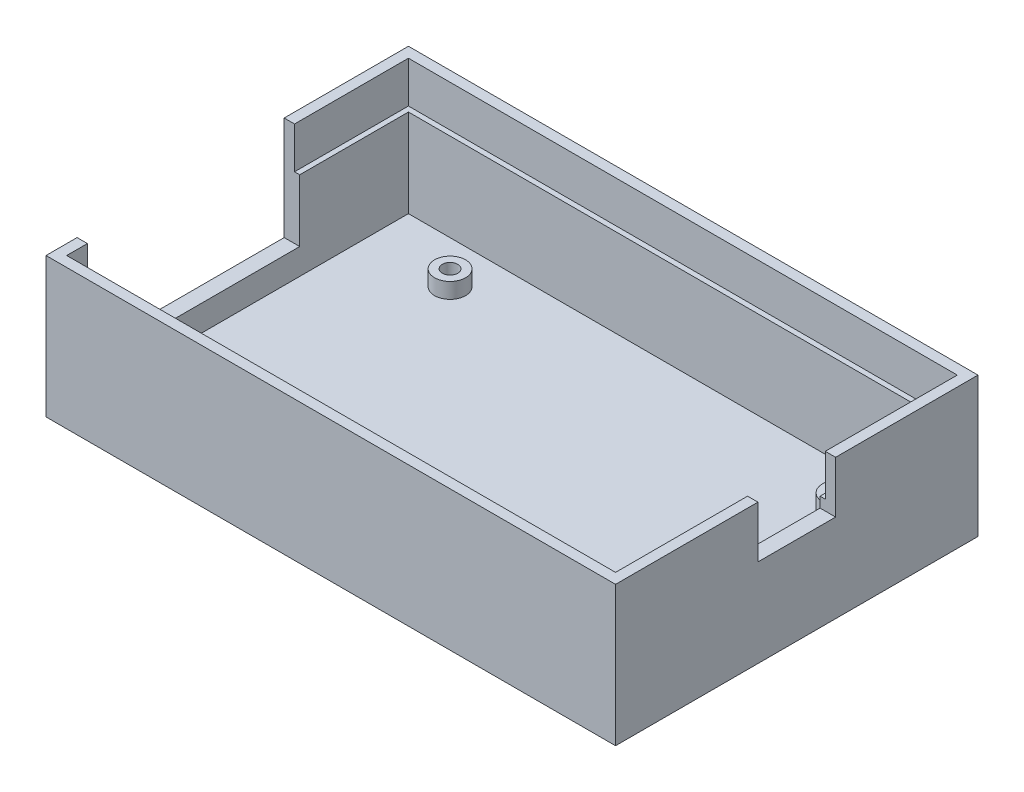
ISO-10303-21;
HEADER;
FILE_DESCRIPTION(('STEP AP214'),'2;1');
FILE_NAME('part.step','',(''),(''),'','','');
FILE_SCHEMA(('AUTOMOTIVE_DESIGN { 1 0 10303 214 1 1 1 1 }'));
ENDSEC;
DATA;
#1=APPLICATION_CONTEXT('core data for automotive mechanical design processes');
#2=APPLICATION_PROTOCOL_DEFINITION('international standard','automotive_design',2000,#1);
#3=PRODUCT_CONTEXT('',#1,'mechanical');
#4=PRODUCT('Part','Part','',(#3));
#5=PRODUCT_RELATED_PRODUCT_CATEGORY('part','',(#4));
#6=PRODUCT_DEFINITION_FORMATION('','',#4);
#7=PRODUCT_DEFINITION_CONTEXT('part definition',#1,'design');
#8=PRODUCT_DEFINITION('design','',#6,#7);
#9=PRODUCT_DEFINITION_SHAPE('','',#8);
#10=(LENGTH_UNIT() NAMED_UNIT(*) SI_UNIT(.MILLI.,.METRE.));
#11=(NAMED_UNIT(*) PLANE_ANGLE_UNIT() SI_UNIT($,.RADIAN.));
#12=(NAMED_UNIT(*) SI_UNIT($,.STERADIAN.) SOLID_ANGLE_UNIT());
#13=UNCERTAINTY_MEASURE_WITH_UNIT(LENGTH_MEASURE(1.E-05),#10,'distance_accuracy_value','');
#14=(GEOMETRIC_REPRESENTATION_CONTEXT(3) GLOBAL_UNCERTAINTY_ASSIGNED_CONTEXT((#13)) GLOBAL_UNIT_ASSIGNED_CONTEXT((#10,
#11,#12)) REPRESENTATION_CONTEXT('',''));
#15=CARTESIAN_POINT('',(0.,0.,0.));
#16=DIRECTION('',(0.,0.,1.));
#17=DIRECTION('',(1.,0.,0.));
#18=AXIS2_PLACEMENT_3D('',#15,#16,#17);
#19=CARTESIAN_POINT('',(0.,27.,0.));
#20=DIRECTION('',(0.,-1.,0.));
#21=DIRECTION('',(0.,0.,-1.));
#22=AXIS2_PLACEMENT_3D('',#19,#20,#21);
#23=PLANE('',#22);
#24=DIRECTION('',(0.,0.,-1.));
#25=VECTOR('',#24,1.);
#26=CARTESIAN_POINT('',(55.,27.,35.));
#27=LINE('',#26,#25);
#28=CARTESIAN_POINT('',(55.,27.,35.));
#29=VERTEX_POINT('',#28);
#30=CARTESIAN_POINT('',(55.,27.,7.5));
#31=VERTEX_POINT('',#30);
#32=EDGE_CURVE('E246',#29,#31,#27,.T.);
#33=ORIENTED_EDGE('',*,*,#32,.T.);
#34=DIRECTION('',(1.,0.,0.));
#35=VECTOR('',#34,1.);
#36=CARTESIAN_POINT('',(48.3230641142944,27.,7.5));
#37=LINE('',#36,#35);
#38=CARTESIAN_POINT('',(53.,27.,7.5));
#39=VERTEX_POINT('',#38);
#40=EDGE_CURVE('E447',#39,#31,#37,.T.);
#41=ORIENTED_EDGE('',*,*,#40,.F.);
#42=DIRECTION('',(0.,0.,-1.));
#43=VECTOR('',#42,1.);
#44=CARTESIAN_POINT('',(53.,27.,33.));
#45=LINE('',#44,#43);
#46=CARTESIAN_POINT('',(53.,27.,33.));
#47=VERTEX_POINT('',#46);
#48=EDGE_CURVE('E349',#47,#39,#45,.T.);
#49=ORIENTED_EDGE('',*,*,#48,.F.);
#50=DIRECTION('',(1.,0.,0.));
#51=VECTOR('',#50,1.);
#52=CARTESIAN_POINT('',(-53.,27.,33.));
#53=LINE('',#52,#51);
#54=CARTESIAN_POINT('',(-53.,27.,33.));
#55=VERTEX_POINT('',#54);
#56=EDGE_CURVE('E338',#55,#47,#53,.T.);
#57=ORIENTED_EDGE('',*,*,#56,.F.);
#58=DIRECTION('',(0.,0.,1.));
#59=VECTOR('',#58,1.);
#60=CARTESIAN_POINT('',(-53.,27.,33.));
#61=LINE('',#60,#59);
#62=CARTESIAN_POINT('',(-53.,27.,29.));
#63=VERTEX_POINT('',#62);
#64=EDGE_CURVE('E345',#63,#55,#61,.T.);
#65=ORIENTED_EDGE('',*,*,#64,.F.);
#66=DIRECTION('',(1.,0.,0.));
#67=VECTOR('',#66,1.);
#68=CARTESIAN_POINT('',(-58.,27.,29.));
#69=LINE('',#68,#67);
#70=CARTESIAN_POINT('',(-55.,27.,29.));
#71=VERTEX_POINT('',#70);
#72=EDGE_CURVE('E423',#71,#63,#69,.T.);
#73=ORIENTED_EDGE('',*,*,#72,.F.);
#74=DIRECTION('',(0.,0.,1.));
#75=VECTOR('',#74,1.);
#76=CARTESIAN_POINT('',(-55.,27.,35.));
#77=LINE('',#76,#75);
#78=CARTESIAN_POINT('',(-55.,27.,35.));
#79=VERTEX_POINT('',#78);
#80=EDGE_CURVE('E252',#71,#79,#77,.T.);
#81=ORIENTED_EDGE('',*,*,#80,.T.);
#82=DIRECTION('',(1.,0.,0.));
#83=VECTOR('',#82,1.);
#84=CARTESIAN_POINT('',(-55.,27.,35.));
#85=LINE('',#84,#83);
#86=EDGE_CURVE('E256',#79,#29,#85,.T.);
#87=ORIENTED_EDGE('',*,*,#86,.T.);
#88=EDGE_LOOP('',(#33,#41,#49,#57,#65,#73,#81,#87));
#89=FACE_BOUND('',#88,.T.);
#90=ADVANCED_FACE('F33',(#89),#23,.F.);
#91=CARTESIAN_POINT('',(53.,19.,33.));
#92=DIRECTION('',(1.,0.,0.));
#93=DIRECTION('',(0.,0.,-1.));
#94=AXIS2_PLACEMENT_3D('',#91,#92,#93);
#95=PLANE('',#94);
#96=ORIENTED_EDGE('',*,*,#48,.T.);
#97=DIRECTION('',(0.,-1.,0.));
#98=VECTOR('',#97,1.);
#99=CARTESIAN_POINT('',(53.,19.,7.5));
#100=LINE('',#99,#98);
#101=CARTESIAN_POINT('',(53.,19.,7.5));
#102=VERTEX_POINT('',#101);
#103=EDGE_CURVE('E435',#39,#102,#100,.T.);
#104=ORIENTED_EDGE('',*,*,#103,.T.);
#105=DIRECTION('',(0.,0.,-1.));
#106=VECTOR('',#105,1.);
#107=CARTESIAN_POINT('',(53.,19.,33.));
#108=LINE('',#107,#106);
#109=CARTESIAN_POINT('',(53.,19.,33.));
#110=VERTEX_POINT('',#109);
#111=EDGE_CURVE('E362',#110,#102,#108,.T.);
#112=ORIENTED_EDGE('',*,*,#111,.F.);
#113=DIRECTION('',(0.,1.,0.));
#114=VECTOR('',#113,1.);
#115=CARTESIAN_POINT('',(53.,19.,33.));
#116=LINE('',#115,#114);
#117=EDGE_CURVE('E326',#110,#47,#116,.T.);
#118=ORIENTED_EDGE('',*,*,#117,.T.);
#119=EDGE_LOOP('',(#96,#104,#112,#118));
#120=FACE_BOUND('',#119,.T.);
#121=ADVANCED_FACE('F496',(#120),#95,.F.);
#122=CARTESIAN_POINT('',(0.,19.,0.));
#123=DIRECTION('',(0.,-1.,0.));
#124=DIRECTION('',(0.,0.,-1.));
#125=AXIS2_PLACEMENT_3D('',#122,#123,#124);
#126=PLANE('',#125);
#127=ORIENTED_EDGE('',*,*,#111,.T.);
#128=DIRECTION('',(-1.,0.,0.));
#129=VECTOR('',#128,1.);
#130=CARTESIAN_POINT('',(0.,19.,7.5));
#131=LINE('',#130,#129);
#132=CARTESIAN_POINT('',(52.,19.,7.5));
#133=VERTEX_POINT('',#132);
#134=EDGE_CURVE('E438',#102,#133,#131,.T.);
#135=ORIENTED_EDGE('',*,*,#134,.T.);
#136=DIRECTION('',(0.,0.,1.));
#137=VECTOR('',#136,1.);
#138=CARTESIAN_POINT('',(52.,19.,32.));
#139=LINE('',#138,#137);
#140=CARTESIAN_POINT('',(52.,19.,32.));
#141=VERTEX_POINT('',#140);
#142=EDGE_CURVE('E213',#133,#141,#139,.T.);
#143=ORIENTED_EDGE('',*,*,#142,.T.);
#144=DIRECTION('',(-1.,0.,0.));
#145=VECTOR('',#144,1.);
#146=CARTESIAN_POINT('',(-52.,19.,32.));
#147=LINE('',#146,#145);
#148=CARTESIAN_POINT('',(-52.,19.,32.));
#149=VERTEX_POINT('',#148);
#150=EDGE_CURVE('E280',#141,#149,#147,.T.);
#151=ORIENTED_EDGE('',*,*,#150,.T.);
#152=DIRECTION('',(0.,0.,-1.));
#153=VECTOR('',#152,1.);
#154=CARTESIAN_POINT('',(-52.,19.,32.));
#155=LINE('',#154,#153);
#156=CARTESIAN_POINT('',(-52.,19.,29.));
#157=VERTEX_POINT('',#156);
#158=EDGE_CURVE('E223',#149,#157,#155,.T.);
#159=ORIENTED_EDGE('',*,*,#158,.T.);
#160=DIRECTION('',(-1.,0.,0.));
#161=VECTOR('',#160,1.);
#162=CARTESIAN_POINT('',(0.,19.,29.));
#163=LINE('',#162,#161);
#164=CARTESIAN_POINT('',(-53.,19.,29.));
#165=VERTEX_POINT('',#164);
#166=EDGE_CURVE('E406',#157,#165,#163,.T.);
#167=ORIENTED_EDGE('',*,*,#166,.T.);
#168=DIRECTION('',(0.,0.,1.));
#169=VECTOR('',#168,1.);
#170=CARTESIAN_POINT('',(-53.,19.,33.));
#171=LINE('',#170,#169);
#172=CARTESIAN_POINT('',(-53.,19.,33.));
#173=VERTEX_POINT('',#172);
#174=EDGE_CURVE('E358',#165,#173,#171,.T.);
#175=ORIENTED_EDGE('',*,*,#174,.T.);
#176=DIRECTION('',(1.,0.,0.));
#177=VECTOR('',#176,1.);
#178=CARTESIAN_POINT('',(-53.,19.,33.));
#179=LINE('',#178,#177);
#180=EDGE_CURVE('E332',#173,#110,#179,.T.);
#181=ORIENTED_EDGE('',*,*,#180,.T.);
#182=EDGE_LOOP('',(#127,#135,#143,#151,#159,#167,#175,#181));
#183=FACE_BOUND('',#182,.T.);
#184=ADVANCED_FACE('F323',(#183),#126,.F.);
#185=CARTESIAN_POINT('',(-53.,19.,33.));
#186=DIRECTION('',(-1.,0.,0.));
#187=DIRECTION('',(0.,0.,1.));
#188=AXIS2_PLACEMENT_3D('',#185,#186,#187);
#189=PLANE('',#188);
#190=ORIENTED_EDGE('',*,*,#174,.F.);
#191=DIRECTION('',(0.,1.,0.));
#192=VECTOR('',#191,1.);
#193=CARTESIAN_POINT('',(-53.,19.,29.));
#194=LINE('',#193,#192);
#195=EDGE_CURVE('E403',#165,#63,#194,.T.);
#196=ORIENTED_EDGE('',*,*,#195,.T.);
#197=ORIENTED_EDGE('',*,*,#64,.T.);
#198=DIRECTION('',(0.,1.,0.));
#199=VECTOR('',#198,1.);
#200=CARTESIAN_POINT('',(-53.,19.,33.));
#201=LINE('',#200,#199);
#202=EDGE_CURVE('E334',#173,#55,#201,.T.);
#203=ORIENTED_EDGE('',*,*,#202,.F.);
#204=EDGE_LOOP('',(#190,#196,#197,#203));
#205=FACE_BOUND('',#204,.T.);
#206=ADVANCED_FACE('F488',(#205),#189,.F.);
#207=CARTESIAN_POINT('',(55.,2.,35.));
#208=DIRECTION('',(-1.,0.,0.));
#209=DIRECTION('',(0.,0.,1.));
#210=AXIS2_PLACEMENT_3D('',#207,#208,#209);
#211=PLANE('',#210);
#212=DIRECTION('',(0.,0.,1.));
#213=VECTOR('',#212,1.);
#214=CARTESIAN_POINT('',(55.,17.,35.));
#215=LINE('',#214,#213);
#216=CARTESIAN_POINT('',(55.,17.,-7.5));
#217=VERTEX_POINT('',#216);
#218=CARTESIAN_POINT('',(55.,17.,7.5));
#219=VERTEX_POINT('',#218);
#220=EDGE_CURVE('E208',#217,#219,#215,.T.);
#221=ORIENTED_EDGE('',*,*,#220,.T.);
#222=DIRECTION('',(0.,1.,0.));
#223=VECTOR('',#222,1.);
#224=CARTESIAN_POINT('',(55.,2.,7.5));
#225=LINE('',#224,#223);
#226=EDGE_CURVE('E207',#219,#31,#225,.T.);
#227=ORIENTED_EDGE('',*,*,#226,.T.);
#228=ORIENTED_EDGE('',*,*,#32,.F.);
#229=DIRECTION('',(0.,-1.,0.));
#230=VECTOR('',#229,1.);
#231=CARTESIAN_POINT('',(55.,2.,35.));
#232=LINE('',#231,#230);
#233=CARTESIAN_POINT('',(55.,0.,35.));
#234=VERTEX_POINT('',#233);
#235=EDGE_CURVE('E268',#29,#234,#232,.T.);
#236=ORIENTED_EDGE('',*,*,#235,.T.);
#237=DIRECTION('',(0.,0.,-1.));
#238=VECTOR('',#237,1.);
#239=CARTESIAN_POINT('',(55.,0.,35.));
#240=LINE('',#239,#238);
#241=CARTESIAN_POINT('',(55.,0.,-35.));
#242=VERTEX_POINT('',#241);
#243=EDGE_CURVE('E259',#234,#242,#240,.T.);
#244=ORIENTED_EDGE('',*,*,#243,.T.);
#245=DIRECTION('',(0.,-1.,0.));
#246=VECTOR('',#245,1.);
#247=CARTESIAN_POINT('',(55.,2.,-35.));
#248=LINE('',#247,#246);
#249=CARTESIAN_POINT('',(55.,27.,-35.));
#250=VERTEX_POINT('',#249);
#251=EDGE_CURVE('E277',#250,#242,#248,.T.);
#252=ORIENTED_EDGE('',*,*,#251,.F.);
#253=CARTESIAN_POINT('',(55.,27.,-7.5));
#254=VERTEX_POINT('',#253);
#255=EDGE_CURVE('E245',#254,#250,#27,.T.);
#256=ORIENTED_EDGE('',*,*,#255,.F.);
#257=DIRECTION('',(0.,-1.,0.));
#258=VECTOR('',#257,1.);
#259=CARTESIAN_POINT('',(55.,2.,-7.5));
#260=LINE('',#259,#258);
#261=EDGE_CURVE('E440',#254,#217,#260,.T.);
#262=ORIENTED_EDGE('',*,*,#261,.T.);
#263=EDGE_LOOP('',(#221,#227,#228,#236,#244,#252,#256,#262));
#264=FACE_BOUND('',#263,.T.);
#265=ADVANCED_FACE('F35',(#264),#211,.F.);
#266=CARTESIAN_POINT('',(-55.,2.,-35.));
#267=DIRECTION('',(0.,0.,1.));
#268=DIRECTION('',(1.,0.,0.));
#269=AXIS2_PLACEMENT_3D('',#266,#267,#268);
#270=PLANE('',#269);
#271=DIRECTION('',(-1.,0.,0.));
#272=VECTOR('',#271,1.);
#273=CARTESIAN_POINT('',(-55.,0.,-35.));
#274=LINE('',#273,#272);
#275=CARTESIAN_POINT('',(-55.,0.,-35.));
#276=VERTEX_POINT('',#275);
#277=EDGE_CURVE('E262',#242,#276,#274,.T.);
#278=ORIENTED_EDGE('',*,*,#277,.T.);
#279=DIRECTION('',(0.,-1.,0.));
#280=VECTOR('',#279,1.);
#281=CARTESIAN_POINT('',(-55.,2.,-35.));
#282=LINE('',#281,#280);
#283=CARTESIAN_POINT('',(-55.,27.,-35.));
#284=VERTEX_POINT('',#283);
#285=EDGE_CURVE('E274',#284,#276,#282,.T.);
#286=ORIENTED_EDGE('',*,*,#285,.F.);
#287=DIRECTION('',(-1.,0.,0.));
#288=VECTOR('',#287,1.);
#289=CARTESIAN_POINT('',(-55.,27.,-35.));
#290=LINE('',#289,#288);
#291=EDGE_CURVE('E249',#250,#284,#290,.T.);
#292=ORIENTED_EDGE('',*,*,#291,.F.);
#293=ORIENTED_EDGE('',*,*,#251,.T.);
#294=EDGE_LOOP('',(#278,#286,#292,#293));
#295=FACE_BOUND('',#294,.T.);
#296=ADVANCED_FACE('F502',(#295),#270,.F.);
#297=CARTESIAN_POINT('',(-55.,2.,35.));
#298=DIRECTION('',(1.,0.,0.));
#299=DIRECTION('',(0.,0.,-1.));
#300=AXIS2_PLACEMENT_3D('',#297,#298,#299);
#301=PLANE('',#300);
#302=ORIENTED_EDGE('',*,*,#80,.F.);
#303=DIRECTION('',(0.,-1.,0.));
#304=VECTOR('',#303,1.);
#305=CARTESIAN_POINT('',(-55.,2.,29.));
#306=LINE('',#305,#304);
#307=CARTESIAN_POINT('',(-55.,7.,29.));
#308=VERTEX_POINT('',#307);
#309=EDGE_CURVE('E387',#71,#308,#306,.T.);
#310=ORIENTED_EDGE('',*,*,#309,.T.);
#311=DIRECTION('',(0.,0.,-1.));
#312=VECTOR('',#311,1.);
#313=CARTESIAN_POINT('',(-55.,7.,35.));
#314=LINE('',#313,#312);
#315=CARTESIAN_POINT('',(-55.,7.,-11.));
#316=VERTEX_POINT('',#315);
#317=EDGE_CURVE('E416',#308,#316,#314,.T.);
#318=ORIENTED_EDGE('',*,*,#317,.T.);
#319=DIRECTION('',(0.,1.,0.));
#320=VECTOR('',#319,1.);
#321=CARTESIAN_POINT('',(-55.,2.,-11.));
#322=LINE('',#321,#320);
#323=CARTESIAN_POINT('',(-55.,27.,-11.));
#324=VERTEX_POINT('',#323);
#325=EDGE_CURVE('E408',#316,#324,#322,.T.);
#326=ORIENTED_EDGE('',*,*,#325,.T.);
#327=EDGE_CURVE('E253',#284,#324,#77,.T.);
#328=ORIENTED_EDGE('',*,*,#327,.F.);
#329=ORIENTED_EDGE('',*,*,#285,.T.);
#330=DIRECTION('',(0.,0.,1.));
#331=VECTOR('',#330,1.);
#332=CARTESIAN_POINT('',(-55.,0.,35.));
#333=LINE('',#332,#331);
#334=CARTESIAN_POINT('',(-55.,0.,35.));
#335=VERTEX_POINT('',#334);
#336=EDGE_CURVE('E264',#276,#335,#333,.T.);
#337=ORIENTED_EDGE('',*,*,#336,.T.);
#338=DIRECTION('',(0.,-1.,0.));
#339=VECTOR('',#338,1.);
#340=CARTESIAN_POINT('',(-55.,2.,35.));
#341=LINE('',#340,#339);
#342=EDGE_CURVE('E271',#79,#335,#341,.T.);
#343=ORIENTED_EDGE('',*,*,#342,.F.);
#344=EDGE_LOOP('',(#302,#310,#318,#326,#328,#329,#337,#343));
#345=FACE_BOUND('',#344,.T.);
#346=ADVANCED_FACE('F474',(#345),#301,.F.);
#347=CARTESIAN_POINT('',(-55.,2.,35.));
#348=DIRECTION('',(0.,0.,-1.));
#349=DIRECTION('',(-1.,0.,0.));
#350=AXIS2_PLACEMENT_3D('',#347,#348,#349);
#351=PLANE('',#350);
#352=DIRECTION('',(1.,0.,0.));
#353=VECTOR('',#352,1.);
#354=CARTESIAN_POINT('',(-55.,0.,35.));
#355=LINE('',#354,#353);
#356=EDGE_CURVE('E266',#335,#234,#355,.T.);
#357=ORIENTED_EDGE('',*,*,#356,.T.);
#358=ORIENTED_EDGE('',*,*,#235,.F.);
#359=ORIENTED_EDGE('',*,*,#86,.F.);
#360=ORIENTED_EDGE('',*,*,#342,.T.);
#361=EDGE_LOOP('',(#357,#358,#359,#360));
#362=FACE_BOUND('',#361,.T.);
#363=ADVANCED_FACE('F507',(#362),#351,.F.);
#364=CARTESIAN_POINT('',(0.,0.,0.));
#365=DIRECTION('',(0.,-1.,0.));
#366=DIRECTION('',(0.,0.,-1.));
#367=AXIS2_PLACEMENT_3D('',#364,#365,#366);
#368=PLANE('',#367);
#369=ORIENTED_EDGE('',*,*,#243,.F.);
#370=ORIENTED_EDGE('',*,*,#356,.F.);
#371=ORIENTED_EDGE('',*,*,#336,.F.);
#372=ORIENTED_EDGE('',*,*,#277,.F.);
#373=EDGE_LOOP('',(#369,#370,#371,#372));
#374=FACE_BOUND('',#373,.T.);
#375=ADVANCED_FACE('F504',(#374),#368,.T.);
#376=CARTESIAN_POINT('',(53.,27.,-7.5));
#377=VERTEX_POINT('',#376);
#378=CARTESIAN_POINT('',(53.,27.,-33.));
#379=VERTEX_POINT('',#378);
#380=EDGE_CURVE('E352',#377,#379,#45,.T.);
#381=ORIENTED_EDGE('',*,*,#380,.F.);
#382=DIRECTION('',(-1.,0.,0.));
#383=VECTOR('',#382,1.);
#384=CARTESIAN_POINT('',(48.3230641142944,27.,-7.5));
#385=LINE('',#384,#383);
#386=EDGE_CURVE('E449',#254,#377,#385,.T.);
#387=ORIENTED_EDGE('',*,*,#386,.F.);
#388=ORIENTED_EDGE('',*,*,#255,.T.);
#389=ORIENTED_EDGE('',*,*,#291,.T.);
#390=ORIENTED_EDGE('',*,*,#327,.T.);
#391=DIRECTION('',(-1.,0.,0.));
#392=VECTOR('',#391,1.);
#393=CARTESIAN_POINT('',(-58.,27.,-11.));
#394=LINE('',#393,#392);
#395=CARTESIAN_POINT('',(-53.,27.,-11.));
#396=VERTEX_POINT('',#395);
#397=EDGE_CURVE('E426',#396,#324,#394,.T.);
#398=ORIENTED_EDGE('',*,*,#397,.F.);
#399=CARTESIAN_POINT('',(-53.,27.,-33.));
#400=VERTEX_POINT('',#399);
#401=EDGE_CURVE('E342',#400,#396,#61,.T.);
#402=ORIENTED_EDGE('',*,*,#401,.F.);
#403=DIRECTION('',(-1.,0.,0.));
#404=VECTOR('',#403,1.);
#405=CARTESIAN_POINT('',(-53.,27.,-33.));
#406=LINE('',#405,#404);
#407=EDGE_CURVE('E346',#379,#400,#406,.T.);
#408=ORIENTED_EDGE('',*,*,#407,.F.);
#409=EDGE_LOOP('',(#381,#387,#388,#389,#390,#398,#402,#408));
#410=FACE_BOUND('',#409,.T.);
#411=ADVANCED_FACE('F459',(#410),#23,.F.);
#412=CARTESIAN_POINT('',(53.,19.,-7.5));
#413=VERTEX_POINT('',#412);
#414=CARTESIAN_POINT('',(53.,19.,-33.));
#415=VERTEX_POINT('',#414);
#416=EDGE_CURVE('E341',#413,#415,#108,.T.);
#417=ORIENTED_EDGE('',*,*,#416,.F.);
#418=DIRECTION('',(0.,1.,0.));
#419=VECTOR('',#418,1.);
#420=CARTESIAN_POINT('',(53.,19.,-7.5));
#421=LINE('',#420,#419);
#422=EDGE_CURVE('E442',#413,#377,#421,.T.);
#423=ORIENTED_EDGE('',*,*,#422,.T.);
#424=ORIENTED_EDGE('',*,*,#380,.T.);
#425=DIRECTION('',(0.,1.,0.));
#426=VECTOR('',#425,1.);
#427=CARTESIAN_POINT('',(53.,19.,-33.));
#428=LINE('',#427,#426);
#429=EDGE_CURVE('E328',#415,#379,#428,.T.);
#430=ORIENTED_EDGE('',*,*,#429,.F.);
#431=EDGE_LOOP('',(#417,#423,#424,#430));
#432=FACE_BOUND('',#431,.T.);
#433=ADVANCED_FACE('F456',(#432),#95,.F.);
#434=CARTESIAN_POINT('',(-53.,19.,33.));
#435=DIRECTION('',(0.,0.,1.));
#436=DIRECTION('',(1.,0.,0.));
#437=AXIS2_PLACEMENT_3D('',#434,#435,#436);
#438=PLANE('',#437);
#439=ORIENTED_EDGE('',*,*,#56,.T.);
#440=ORIENTED_EDGE('',*,*,#117,.F.);
#441=ORIENTED_EDGE('',*,*,#180,.F.);
#442=ORIENTED_EDGE('',*,*,#202,.T.);
#443=EDGE_LOOP('',(#439,#440,#441,#442));
#444=FACE_BOUND('',#443,.T.);
#445=ADVANCED_FACE('F493',(#444),#438,.F.);
#446=ORIENTED_EDGE('',*,*,#401,.T.);
#447=DIRECTION('',(0.,-1.,0.));
#448=VECTOR('',#447,1.);
#449=CARTESIAN_POINT('',(-53.,19.,-11.));
#450=LINE('',#449,#448);
#451=CARTESIAN_POINT('',(-53.,19.,-11.));
#452=VERTEX_POINT('',#451);
#453=EDGE_CURVE('E411',#396,#452,#450,.T.);
#454=ORIENTED_EDGE('',*,*,#453,.T.);
#455=CARTESIAN_POINT('',(-53.,19.,-33.));
#456=VERTEX_POINT('',#455);
#457=EDGE_CURVE('E355',#456,#452,#171,.T.);
#458=ORIENTED_EDGE('',*,*,#457,.F.);
#459=DIRECTION('',(0.,1.,0.));
#460=VECTOR('',#459,1.);
#461=CARTESIAN_POINT('',(-53.,19.,-33.));
#462=LINE('',#461,#460);
#463=EDGE_CURVE('E331',#456,#400,#462,.T.);
#464=ORIENTED_EDGE('',*,*,#463,.T.);
#465=EDGE_LOOP('',(#446,#454,#458,#464));
#466=FACE_BOUND('',#465,.T.);
#467=ADVANCED_FACE('F467',(#466),#189,.F.);
#468=CARTESIAN_POINT('',(-53.,19.,-33.));
#469=DIRECTION('',(0.,0.,-1.));
#470=DIRECTION('',(-1.,0.,0.));
#471=AXIS2_PLACEMENT_3D('',#468,#469,#470);
#472=PLANE('',#471);
#473=ORIENTED_EDGE('',*,*,#407,.T.);
#474=ORIENTED_EDGE('',*,*,#463,.F.);
#475=DIRECTION('',(-1.,0.,0.));
#476=VECTOR('',#475,1.);
#477=CARTESIAN_POINT('',(-53.,19.,-33.));
#478=LINE('',#477,#476);
#479=EDGE_CURVE('E359',#415,#456,#478,.T.);
#480=ORIENTED_EDGE('',*,*,#479,.F.);
#481=ORIENTED_EDGE('',*,*,#429,.T.);
#482=EDGE_LOOP('',(#473,#474,#480,#481));
#483=FACE_BOUND('',#482,.T.);
#484=ADVANCED_FACE('F463',(#483),#472,.F.);
#485=CARTESIAN_POINT('',(52.,19.,-32.));
#486=VERTEX_POINT('',#485);
#487=CARTESIAN_POINT('',(52.,19.,-7.5));
#488=VERTEX_POINT('',#487);
#489=EDGE_CURVE('E218',#486,#488,#139,.T.);
#490=ORIENTED_EDGE('',*,*,#489,.T.);
#491=DIRECTION('',(1.,0.,0.));
#492=VECTOR('',#491,1.);
#493=CARTESIAN_POINT('',(0.,19.,-7.5));
#494=LINE('',#493,#492);
#495=EDGE_CURVE('E296',#488,#413,#494,.T.);
#496=ORIENTED_EDGE('',*,*,#495,.T.);
#497=ORIENTED_EDGE('',*,*,#416,.T.);
#498=ORIENTED_EDGE('',*,*,#479,.T.);
#499=ORIENTED_EDGE('',*,*,#457,.T.);
#500=DIRECTION('',(1.,0.,0.));
#501=VECTOR('',#500,1.);
#502=CARTESIAN_POINT('',(0.,19.,-11.));
#503=LINE('',#502,#501);
#504=CARTESIAN_POINT('',(-52.,19.,-11.));
#505=VERTEX_POINT('',#504);
#506=EDGE_CURVE('E414',#452,#505,#503,.T.);
#507=ORIENTED_EDGE('',*,*,#506,.T.);
#508=CARTESIAN_POINT('',(-52.,19.,-32.));
#509=VERTEX_POINT('',#508);
#510=EDGE_CURVE('E305',#505,#509,#155,.T.);
#511=ORIENTED_EDGE('',*,*,#510,.T.);
#512=DIRECTION('',(1.,0.,0.));
#513=VECTOR('',#512,1.);
#514=CARTESIAN_POINT('',(-52.,19.,-32.));
#515=LINE('',#514,#513);
#516=EDGE_CURVE('E219',#509,#486,#515,.T.);
#517=ORIENTED_EDGE('',*,*,#516,.T.);
#518=EDGE_LOOP('',(#490,#496,#497,#498,#499,#507,#511,#517));
#519=FACE_BOUND('',#518,.T.);
#520=ADVANCED_FACE('F300',(#519),#126,.F.);
#521=CARTESIAN_POINT('',(0.,2.,0.));
#522=DIRECTION('',(0.,-1.,0.));
#523=DIRECTION('',(0.,0.,-1.));
#524=AXIS2_PLACEMENT_3D('',#521,#522,#523);
#525=PLANE('',#524);
#526=CARTESIAN_POINT('',(45.52,2.,24.46));
#527=DIRECTION('',(0.,-1.,0.));
#528=DIRECTION('',(0.,0.,-1.));
#529=AXIS2_PLACEMENT_3D('',#526,#527,#528);
#530=CIRCLE('',#529,3.);
#531=CARTESIAN_POINT('',(45.52,2.,21.46));
#532=VERTEX_POINT('',#531);
#533=EDGE_CURVE('E201',#532,#532,#530,.F.);
#534=ORIENTED_EDGE('',*,*,#533,.F.);
#535=EDGE_LOOP('',(#534));
#536=FACE_BOUND('',#535,.T.);
#537=CARTESIAN_POINT('',(39.17,2.,-23.8));
#538=DIRECTION('',(0.,-1.,0.));
#539=DIRECTION('',(0.,0.,-1.));
#540=AXIS2_PLACEMENT_3D('',#537,#538,#539);
#541=CIRCLE('',#540,3.);
#542=CARTESIAN_POINT('',(39.17,2.,-26.8));
#543=VERTEX_POINT('',#542);
#544=EDGE_CURVE('E288',#543,#543,#541,.F.);
#545=ORIENTED_EDGE('',*,*,#544,.F.);
#546=EDGE_LOOP('',(#545));
#547=FACE_BOUND('',#546,.T.);
#548=CARTESIAN_POINT('',(-35.76,2.,-23.8));
#549=DIRECTION('',(0.,-1.,0.));
#550=DIRECTION('',(0.,0.,-1.));
#551=AXIS2_PLACEMENT_3D('',#548,#549,#550);
#552=CIRCLE('',#551,3.);
#553=CARTESIAN_POINT('',(-35.76,2.,-26.8));
#554=VERTEX_POINT('',#553);
#555=EDGE_CURVE('E285',#554,#554,#552,.F.);
#556=ORIENTED_EDGE('',*,*,#555,.F.);
#557=EDGE_LOOP('',(#556));
#558=FACE_BOUND('',#557,.T.);
#559=CARTESIAN_POINT('',(-37.03,2.,24.46));
#560=DIRECTION('',(0.,-1.,0.));
#561=DIRECTION('',(0.,0.,-1.));
#562=AXIS2_PLACEMENT_3D('',#559,#560,#561);
#563=CIRCLE('',#562,3.);
#564=CARTESIAN_POINT('',(-37.03,2.,21.46));
#565=VERTEX_POINT('',#564);
#566=EDGE_CURVE('E282',#565,#565,#563,.F.);
#567=ORIENTED_EDGE('',*,*,#566,.F.);
#568=EDGE_LOOP('',(#567));
#569=FACE_BOUND('',#568,.T.);
#570=DIRECTION('',(1.,0.,0.));
#571=VECTOR('',#570,1.);
#572=CARTESIAN_POINT('',(-52.,2.,32.));
#573=LINE('',#572,#571);
#574=CARTESIAN_POINT('',(-52.,2.,32.));
#575=VERTEX_POINT('',#574);
#576=CARTESIAN_POINT('',(52.,2.,32.));
#577=VERTEX_POINT('',#576);
#578=EDGE_CURVE('E235',#575,#577,#573,.T.);
#579=ORIENTED_EDGE('',*,*,#578,.T.);
#580=DIRECTION('',(0.,0.,-1.));
#581=VECTOR('',#580,1.);
#582=CARTESIAN_POINT('',(52.,2.,32.));
#583=LINE('',#582,#581);
#584=CARTESIAN_POINT('',(52.,2.,-32.));
#585=VERTEX_POINT('',#584);
#586=EDGE_CURVE('E222',#577,#585,#583,.T.);
#587=ORIENTED_EDGE('',*,*,#586,.T.);
#588=DIRECTION('',(-1.,0.,0.));
#589=VECTOR('',#588,1.);
#590=CARTESIAN_POINT('',(-52.,2.,-32.));
#591=LINE('',#590,#589);
#592=CARTESIAN_POINT('',(-52.,2.,-32.));
#593=VERTEX_POINT('',#592);
#594=EDGE_CURVE('E229',#585,#593,#591,.T.);
#595=ORIENTED_EDGE('',*,*,#594,.T.);
#596=DIRECTION('',(0.,0.,1.));
#597=VECTOR('',#596,1.);
#598=CARTESIAN_POINT('',(-52.,2.,32.));
#599=LINE('',#598,#597);
#600=EDGE_CURVE('E232',#593,#575,#599,.T.);
#601=ORIENTED_EDGE('',*,*,#600,.T.);
#602=EDGE_LOOP('',(#579,#587,#595,#601));
#603=FACE_BOUND('',#602,.T.);
#604=ADVANCED_FACE('F318',(#536,#547,#558,#569,#603),#525,.F.);
#605=CARTESIAN_POINT('',(-52.,27.,32.));
#606=DIRECTION('',(0.,0.,-1.));
#607=DIRECTION('',(-1.,0.,0.));
#608=AXIS2_PLACEMENT_3D('',#605,#606,#607);
#609=PLANE('',#608);
#610=ORIENTED_EDGE('',*,*,#150,.F.);
#611=DIRECTION('',(0.,-1.,0.));
#612=VECTOR('',#611,1.);
#613=CARTESIAN_POINT('',(52.,27.,32.));
#614=LINE('',#613,#612);
#615=EDGE_CURVE('E215',#141,#577,#614,.T.);
#616=ORIENTED_EDGE('',*,*,#615,.T.);
#617=ORIENTED_EDGE('',*,*,#578,.F.);
#618=DIRECTION('',(0.,-1.,0.));
#619=VECTOR('',#618,1.);
#620=CARTESIAN_POINT('',(-52.,27.,32.));
#621=LINE('',#620,#619);
#622=EDGE_CURVE('E239',#149,#575,#621,.T.);
#623=ORIENTED_EDGE('',*,*,#622,.F.);
#624=EDGE_LOOP('',(#610,#616,#617,#623));
#625=FACE_BOUND('',#624,.T.);
#626=ADVANCED_FACE('F320',(#625),#609,.T.);
#627=CARTESIAN_POINT('',(-52.,27.,32.));
#628=DIRECTION('',(1.,0.,0.));
#629=DIRECTION('',(0.,0.,-1.));
#630=AXIS2_PLACEMENT_3D('',#627,#628,#629);
#631=PLANE('',#630);
#632=DIRECTION('',(0.,1.,0.));
#633=VECTOR('',#632,1.);
#634=CARTESIAN_POINT('',(-52.,7.,29.));
#635=LINE('',#634,#633);
#636=CARTESIAN_POINT('',(-52.,7.,29.));
#637=VERTEX_POINT('',#636);
#638=EDGE_CURVE('E56',#637,#157,#635,.T.);
#639=ORIENTED_EDGE('',*,*,#638,.T.);
#640=ORIENTED_EDGE('',*,*,#158,.F.);
#641=ORIENTED_EDGE('',*,*,#622,.T.);
#642=ORIENTED_EDGE('',*,*,#600,.F.);
#643=DIRECTION('',(0.,-1.,0.));
#644=VECTOR('',#643,1.);
#645=CARTESIAN_POINT('',(-52.,27.,-32.));
#646=LINE('',#645,#644);
#647=EDGE_CURVE('E241',#509,#593,#646,.T.);
#648=ORIENTED_EDGE('',*,*,#647,.F.);
#649=ORIENTED_EDGE('',*,*,#510,.F.);
#650=DIRECTION('',(0.,1.,0.));
#651=VECTOR('',#650,1.);
#652=CARTESIAN_POINT('',(-52.,7.,-11.));
#653=LINE('',#652,#651);
#654=CARTESIAN_POINT('',(-52.,7.,-11.));
#655=VERTEX_POINT('',#654);
#656=EDGE_CURVE('E419',#655,#505,#653,.T.);
#657=ORIENTED_EDGE('',*,*,#656,.F.);
#658=DIRECTION('',(0.,0.,-1.));
#659=VECTOR('',#658,1.);
#660=CARTESIAN_POINT('',(-52.,7.,29.));
#661=LINE('',#660,#659);
#662=EDGE_CURVE('E425',#637,#655,#661,.T.);
#663=ORIENTED_EDGE('',*,*,#662,.F.);
#664=EDGE_LOOP('',(#639,#640,#641,#642,#648,#649,#657,#663));
#665=FACE_BOUND('',#664,.T.);
#666=ADVANCED_FACE('F312',(#665),#631,.T.);
#667=CARTESIAN_POINT('',(-52.,27.,-32.));
#668=DIRECTION('',(0.,0.,1.));
#669=DIRECTION('',(1.,0.,0.));
#670=AXIS2_PLACEMENT_3D('',#667,#668,#669);
#671=PLANE('',#670);
#672=ORIENTED_EDGE('',*,*,#516,.F.);
#673=ORIENTED_EDGE('',*,*,#647,.T.);
#674=ORIENTED_EDGE('',*,*,#594,.F.);
#675=DIRECTION('',(0.,-1.,0.));
#676=VECTOR('',#675,1.);
#677=CARTESIAN_POINT('',(52.,27.,-32.));
#678=LINE('',#677,#676);
#679=EDGE_CURVE('E243',#486,#585,#678,.T.);
#680=ORIENTED_EDGE('',*,*,#679,.F.);
#681=EDGE_LOOP('',(#672,#673,#674,#680));
#682=FACE_BOUND('',#681,.T.);
#683=ADVANCED_FACE('F308',(#682),#671,.T.);
#684=CARTESIAN_POINT('',(52.,27.,32.));
#685=DIRECTION('',(-1.,0.,0.));
#686=DIRECTION('',(0.,0.,1.));
#687=AXIS2_PLACEMENT_3D('',#684,#685,#686);
#688=PLANE('',#687);
#689=DIRECTION('',(0.,1.,0.));
#690=VECTOR('',#689,1.);
#691=CARTESIAN_POINT('',(52.,27.,7.5));
#692=LINE('',#691,#690);
#693=CARTESIAN_POINT('',(52.,17.,7.5));
#694=VERTEX_POINT('',#693);
#695=EDGE_CURVE('E11',#694,#133,#692,.T.);
#696=ORIENTED_EDGE('',*,*,#695,.F.);
#697=DIRECTION('',(0.,0.,1.));
#698=VECTOR('',#697,1.);
#699=CARTESIAN_POINT('',(52.,17.,32.));
#700=LINE('',#699,#698);
#701=CARTESIAN_POINT('',(52.,17.,-7.5));
#702=VERTEX_POINT('',#701);
#703=EDGE_CURVE('E193',#702,#694,#700,.T.);
#704=ORIENTED_EDGE('',*,*,#703,.F.);
#705=DIRECTION('',(0.,-1.,0.));
#706=VECTOR('',#705,1.);
#707=CARTESIAN_POINT('',(52.,27.,-7.5));
#708=LINE('',#707,#706);
#709=EDGE_CURVE('E41',#488,#702,#708,.T.);
#710=ORIENTED_EDGE('',*,*,#709,.F.);
#711=ORIENTED_EDGE('',*,*,#489,.F.);
#712=ORIENTED_EDGE('',*,*,#679,.T.);
#713=ORIENTED_EDGE('',*,*,#586,.F.);
#714=ORIENTED_EDGE('',*,*,#615,.F.);
#715=ORIENTED_EDGE('',*,*,#142,.F.);
#716=EDGE_LOOP('',(#696,#704,#710,#711,#712,#713,#714,#715));
#717=FACE_BOUND('',#716,.T.);
#718=ADVANCED_FACE('F211',(#717),#688,.T.);
#719=CARTESIAN_POINT('',(-37.03,5.,24.46));
#720=DIRECTION('',(0.,-1.,0.));
#721=DIRECTION('',(0.,0.,-1.));
#722=AXIS2_PLACEMENT_3D('',#719,#720,#721);
#723=CYLINDRICAL_SURFACE('',#722,3.);
#724=CARTESIAN_POINT('',(-37.03,5.,24.46));
#725=DIRECTION('',(0.,1.,0.));
#726=DIRECTION('',(0.,0.,1.));
#727=AXIS2_PLACEMENT_3D('',#724,#725,#726);
#728=CIRCLE('',#727,3.);
#729=CARTESIAN_POINT('',(-37.03,5.,27.46));
#730=VERTEX_POINT('',#729);
#731=EDGE_CURVE('E364',#730,#730,#728,.T.);
#732=ORIENTED_EDGE('',*,*,#731,.F.);
#733=EDGE_LOOP('',(#732));
#734=FACE_BOUND('',#733,.T.);
#735=ORIENTED_EDGE('',*,*,#566,.T.);
#736=EDGE_LOOP('',(#735));
#737=FACE_BOUND('',#736,.T.);
#738=ADVANCED_FACE('F541',(#734,#737),#723,.T.);
#739=CARTESIAN_POINT('',(-37.03,5.,24.46));
#740=DIRECTION('',(0.,1.,0.));
#741=DIRECTION('',(0.,0.,1.));
#742=AXIS2_PLACEMENT_3D('',#739,#740,#741);
#743=PLANE('',#742);
#744=CARTESIAN_POINT('',(-37.03,5.,24.46));
#745=DIRECTION('',(0.,1.,0.));
#746=DIRECTION('',(0.,0.,1.));
#747=AXIS2_PLACEMENT_3D('',#744,#745,#746);
#748=CIRCLE('',#747,1.5);
#749=CARTESIAN_POINT('',(-37.03,5.,25.96));
#750=VERTEX_POINT('',#749);
#751=EDGE_CURVE('E396',#750,#750,#748,.T.);
#752=ORIENTED_EDGE('',*,*,#751,.F.);
#753=EDGE_LOOP('',(#752));
#754=FACE_BOUND('',#753,.T.);
#755=ORIENTED_EDGE('',*,*,#731,.T.);
#756=EDGE_LOOP('',(#755));
#757=FACE_BOUND('',#756,.T.);
#758=ADVANCED_FACE('F545',(#754,#757),#743,.T.);
#759=CARTESIAN_POINT('',(-35.76,5.,-23.8));
#760=DIRECTION('',(0.,-1.,0.));
#761=DIRECTION('',(0.,0.,-1.));
#762=AXIS2_PLACEMENT_3D('',#759,#760,#761);
#763=CYLINDRICAL_SURFACE('',#762,3.);
#764=CARTESIAN_POINT('',(-35.76,5.,-23.8));
#765=DIRECTION('',(0.,1.,0.));
#766=DIRECTION('',(0.,0.,1.));
#767=AXIS2_PLACEMENT_3D('',#764,#765,#766);
#768=CIRCLE('',#767,3.);
#769=CARTESIAN_POINT('',(-35.76,5.,-20.8));
#770=VERTEX_POINT('',#769);
#771=EDGE_CURVE('E367',#770,#770,#768,.T.);
#772=ORIENTED_EDGE('',*,*,#771,.F.);
#773=EDGE_LOOP('',(#772));
#774=FACE_BOUND('',#773,.T.);
#775=ORIENTED_EDGE('',*,*,#555,.T.);
#776=EDGE_LOOP('',(#775));
#777=FACE_BOUND('',#776,.T.);
#778=ADVANCED_FACE('F551',(#774,#777),#763,.T.);
#779=CARTESIAN_POINT('',(-35.76,5.,-23.8));
#780=DIRECTION('',(0.,1.,0.));
#781=DIRECTION('',(0.,0.,1.));
#782=AXIS2_PLACEMENT_3D('',#779,#780,#781);
#783=PLANE('',#782);
#784=CARTESIAN_POINT('',(-35.76,5.,-23.8));
#785=DIRECTION('',(0.,1.,0.));
#786=DIRECTION('',(0.,0.,1.));
#787=AXIS2_PLACEMENT_3D('',#784,#785,#786);
#788=CIRCLE('',#787,1.5);
#789=CARTESIAN_POINT('',(-35.76,5.,-22.3));
#790=VERTEX_POINT('',#789);
#791=EDGE_CURVE('E377',#790,#790,#788,.T.);
#792=ORIENTED_EDGE('',*,*,#791,.F.);
#793=EDGE_LOOP('',(#792));
#794=FACE_BOUND('',#793,.T.);
#795=ORIENTED_EDGE('',*,*,#771,.T.);
#796=EDGE_LOOP('',(#795));
#797=FACE_BOUND('',#796,.T.);
#798=ADVANCED_FACE('F744',(#794,#797),#783,.T.);
#799=CARTESIAN_POINT('',(39.17,5.,-23.8));
#800=DIRECTION('',(0.,-1.,0.));
#801=DIRECTION('',(0.,0.,-1.));
#802=AXIS2_PLACEMENT_3D('',#799,#800,#801);
#803=CYLINDRICAL_SURFACE('',#802,3.);
#804=CARTESIAN_POINT('',(39.17,5.,-23.8));
#805=DIRECTION('',(0.,1.,0.));
#806=DIRECTION('',(0.,0.,1.));
#807=AXIS2_PLACEMENT_3D('',#804,#805,#806);
#808=CIRCLE('',#807,3.);
#809=CARTESIAN_POINT('',(39.17,5.,-20.8));
#810=VERTEX_POINT('',#809);
#811=EDGE_CURVE('E370',#810,#810,#808,.T.);
#812=ORIENTED_EDGE('',*,*,#811,.F.);
#813=EDGE_LOOP('',(#812));
#814=FACE_BOUND('',#813,.T.);
#815=ORIENTED_EDGE('',*,*,#544,.T.);
#816=EDGE_LOOP('',(#815));
#817=FACE_BOUND('',#816,.T.);
#818=ADVANCED_FACE('F736',(#814,#817),#803,.T.);
#819=CARTESIAN_POINT('',(39.17,5.,-23.8));
#820=DIRECTION('',(0.,1.,0.));
#821=DIRECTION('',(0.,0.,1.));
#822=AXIS2_PLACEMENT_3D('',#819,#820,#821);
#823=PLANE('',#822);
#824=CARTESIAN_POINT('',(39.17,5.,-23.8));
#825=DIRECTION('',(0.,1.,0.));
#826=DIRECTION('',(0.,0.,1.));
#827=AXIS2_PLACEMENT_3D('',#824,#825,#826);
#828=CIRCLE('',#827,1.5);
#829=CARTESIAN_POINT('',(39.17,5.,-22.3));
#830=VERTEX_POINT('',#829);
#831=EDGE_CURVE('E390',#830,#830,#828,.T.);
#832=ORIENTED_EDGE('',*,*,#831,.F.);
#833=EDGE_LOOP('',(#832));
#834=FACE_BOUND('',#833,.T.);
#835=ORIENTED_EDGE('',*,*,#811,.T.);
#836=EDGE_LOOP('',(#835));
#837=FACE_BOUND('',#836,.T.);
#838=ADVANCED_FACE('F731',(#834,#837),#823,.T.);
#839=CARTESIAN_POINT('',(45.52,5.,24.46));
#840=DIRECTION('',(0.,-1.,0.));
#841=DIRECTION('',(0.,0.,-1.));
#842=AXIS2_PLACEMENT_3D('',#839,#840,#841);
#843=CYLINDRICAL_SURFACE('',#842,3.);
#844=CARTESIAN_POINT('',(45.52,5.,24.46));
#845=DIRECTION('',(0.,1.,0.));
#846=DIRECTION('',(0.,0.,1.));
#847=AXIS2_PLACEMENT_3D('',#844,#845,#846);
#848=CIRCLE('',#847,3.);
#849=CARTESIAN_POINT('',(45.52,5.,27.46));
#850=VERTEX_POINT('',#849);
#851=EDGE_CURVE('E373',#850,#850,#848,.T.);
#852=ORIENTED_EDGE('',*,*,#851,.F.);
#853=EDGE_LOOP('',(#852));
#854=FACE_BOUND('',#853,.T.);
#855=ORIENTED_EDGE('',*,*,#533,.T.);
#856=EDGE_LOOP('',(#855));
#857=FACE_BOUND('',#856,.T.);
#858=ADVANCED_FACE('F723',(#854,#857),#843,.T.);
#859=CARTESIAN_POINT('',(45.52,5.,24.46));
#860=DIRECTION('',(0.,1.,0.));
#861=DIRECTION('',(0.,0.,1.));
#862=AXIS2_PLACEMENT_3D('',#859,#860,#861);
#863=PLANE('',#862);
#864=CARTESIAN_POINT('',(45.52,5.,24.46));
#865=DIRECTION('',(0.,1.,0.));
#866=DIRECTION('',(0.,0.,1.));
#867=AXIS2_PLACEMENT_3D('',#864,#865,#866);
#868=CIRCLE('',#867,1.5);
#869=CARTESIAN_POINT('',(45.52,5.,25.96));
#870=VERTEX_POINT('',#869);
#871=EDGE_CURVE('E383',#870,#870,#868,.T.);
#872=ORIENTED_EDGE('',*,*,#871,.F.);
#873=EDGE_LOOP('',(#872));
#874=FACE_BOUND('',#873,.T.);
#875=ORIENTED_EDGE('',*,*,#851,.T.);
#876=EDGE_LOOP('',(#875));
#877=FACE_BOUND('',#876,.T.);
#878=ADVANCED_FACE('F713',(#874,#877),#863,.T.);
#879=CARTESIAN_POINT('',(45.52,1.,24.46));
#880=DIRECTION('',(0.,1.,0.));
#881=DIRECTION('',(0.,0.,1.));
#882=AXIS2_PLACEMENT_3D('',#879,#880,#881);
#883=CYLINDRICAL_SURFACE('',#882,1.5);
#884=CARTESIAN_POINT('',(45.52,1.,24.46));
#885=DIRECTION('',(0.,1.,0.));
#886=DIRECTION('',(0.,0.,1.));
#887=AXIS2_PLACEMENT_3D('',#884,#885,#886);
#888=CIRCLE('',#887,1.5);
#889=CARTESIAN_POINT('',(45.52,1.,25.96));
#890=VERTEX_POINT('',#889);
#891=EDGE_CURVE('E386',#890,#890,#888,.T.);
#892=ORIENTED_EDGE('',*,*,#891,.F.);
#893=EDGE_LOOP('',(#892));
#894=FACE_BOUND('',#893,.T.);
#895=ORIENTED_EDGE('',*,*,#871,.T.);
#896=EDGE_LOOP('',(#895));
#897=FACE_BOUND('',#896,.T.);
#898=ADVANCED_FACE('F703',(#894,#897),#883,.F.);
#899=CARTESIAN_POINT('',(45.52,1.,24.46));
#900=DIRECTION('',(0.,1.,0.));
#901=DIRECTION('',(0.,0.,1.));
#902=AXIS2_PLACEMENT_3D('',#899,#900,#901);
#903=PLANE('',#902);
#904=ORIENTED_EDGE('',*,*,#891,.T.);
#905=EDGE_LOOP('',(#904));
#906=FACE_BOUND('',#905,.T.);
#907=ADVANCED_FACE('F693',(#906),#903,.T.);
#908=CARTESIAN_POINT('',(39.17,1.,-23.8));
#909=DIRECTION('',(0.,1.,0.));
#910=DIRECTION('',(0.,0.,1.));
#911=AXIS2_PLACEMENT_3D('',#908,#909,#910);
#912=CYLINDRICAL_SURFACE('',#911,1.5);
#913=CARTESIAN_POINT('',(39.17,1.,-23.8));
#914=DIRECTION('',(0.,1.,0.));
#915=DIRECTION('',(0.,0.,1.));
#916=AXIS2_PLACEMENT_3D('',#913,#914,#915);
#917=CIRCLE('',#916,1.5);
#918=CARTESIAN_POINT('',(39.17,1.,-22.3));
#919=VERTEX_POINT('',#918);
#920=EDGE_CURVE('E393',#919,#919,#917,.T.);
#921=ORIENTED_EDGE('',*,*,#920,.F.);
#922=EDGE_LOOP('',(#921));
#923=FACE_BOUND('',#922,.T.);
#924=ORIENTED_EDGE('',*,*,#831,.T.);
#925=EDGE_LOOP('',(#924));
#926=FACE_BOUND('',#925,.T.);
#927=ADVANCED_FACE('F683',(#923,#926),#912,.F.);
#928=CARTESIAN_POINT('',(39.17,1.,-23.8));
#929=DIRECTION('',(0.,1.,0.));
#930=DIRECTION('',(0.,0.,1.));
#931=AXIS2_PLACEMENT_3D('',#928,#929,#930);
#932=PLANE('',#931);
#933=ORIENTED_EDGE('',*,*,#920,.T.);
#934=EDGE_LOOP('',(#933));
#935=FACE_BOUND('',#934,.T.);
#936=ADVANCED_FACE('F673',(#935),#932,.T.);
#937=CARTESIAN_POINT('',(-35.76,1.,-23.8));
#938=DIRECTION('',(0.,1.,0.));
#939=DIRECTION('',(0.,0.,1.));
#940=AXIS2_PLACEMENT_3D('',#937,#938,#939);
#941=CYLINDRICAL_SURFACE('',#940,1.5);
#942=CARTESIAN_POINT('',(-35.76,1.,-23.8));
#943=DIRECTION('',(0.,1.,0.));
#944=DIRECTION('',(0.,0.,1.));
#945=AXIS2_PLACEMENT_3D('',#942,#943,#944);
#946=CIRCLE('',#945,1.5);
#947=CARTESIAN_POINT('',(-35.76,1.,-22.3));
#948=VERTEX_POINT('',#947);
#949=EDGE_CURVE('E376',#948,#948,#946,.T.);
#950=ORIENTED_EDGE('',*,*,#949,.F.);
#951=EDGE_LOOP('',(#950));
#952=FACE_BOUND('',#951,.T.);
#953=ORIENTED_EDGE('',*,*,#791,.T.);
#954=EDGE_LOOP('',(#953));
#955=FACE_BOUND('',#954,.T.);
#956=ADVANCED_FACE('F663',(#952,#955),#941,.F.);
#957=CARTESIAN_POINT('',(-35.76,1.,-23.8));
#958=DIRECTION('',(0.,1.,0.));
#959=DIRECTION('',(0.,0.,1.));
#960=AXIS2_PLACEMENT_3D('',#957,#958,#959);
#961=PLANE('',#960);
#962=ORIENTED_EDGE('',*,*,#949,.T.);
#963=EDGE_LOOP('',(#962));
#964=FACE_BOUND('',#963,.T.);
#965=ADVANCED_FACE('F653',(#964),#961,.T.);
#966=CARTESIAN_POINT('',(-37.03,1.,24.46));
#967=DIRECTION('',(0.,1.,0.));
#968=DIRECTION('',(0.,0.,1.));
#969=AXIS2_PLACEMENT_3D('',#966,#967,#968);
#970=CYLINDRICAL_SURFACE('',#969,1.5);
#971=CARTESIAN_POINT('',(-37.03,1.,24.46));
#972=DIRECTION('',(0.,1.,0.));
#973=DIRECTION('',(0.,0.,1.));
#974=AXIS2_PLACEMENT_3D('',#971,#972,#973);
#975=CIRCLE('',#974,1.5);
#976=CARTESIAN_POINT('',(-37.03,1.,25.96));
#977=VERTEX_POINT('',#976);
#978=EDGE_CURVE('E380',#977,#977,#975,.T.);
#979=ORIENTED_EDGE('',*,*,#978,.F.);
#980=EDGE_LOOP('',(#979));
#981=FACE_BOUND('',#980,.T.);
#982=ORIENTED_EDGE('',*,*,#751,.T.);
#983=EDGE_LOOP('',(#982));
#984=FACE_BOUND('',#983,.T.);
#985=ADVANCED_FACE('F643',(#981,#984),#970,.F.);
#986=CARTESIAN_POINT('',(-37.03,1.,24.46));
#987=DIRECTION('',(0.,1.,0.));
#988=DIRECTION('',(0.,0.,1.));
#989=AXIS2_PLACEMENT_3D('',#986,#987,#988);
#990=PLANE('',#989);
#991=ORIENTED_EDGE('',*,*,#978,.T.);
#992=EDGE_LOOP('',(#991));
#993=FACE_BOUND('',#992,.T.);
#994=ADVANCED_FACE('F606',(#993),#990,.T.);
#995=CARTESIAN_POINT('',(-58.,7.,29.));
#996=DIRECTION('',(0.,0.,1.));
#997=DIRECTION('',(1.,0.,0.));
#998=AXIS2_PLACEMENT_3D('',#995,#996,#997);
#999=PLANE('',#998);
#1000=ORIENTED_EDGE('',*,*,#72,.T.);
#1001=ORIENTED_EDGE('',*,*,#195,.F.);
#1002=ORIENTED_EDGE('',*,*,#166,.F.);
#1003=ORIENTED_EDGE('',*,*,#638,.F.);
#1004=DIRECTION('',(1.,0.,0.));
#1005=VECTOR('',#1004,1.);
#1006=CARTESIAN_POINT('',(-58.,7.,29.));
#1007=LINE('',#1006,#1005);
#1008=EDGE_CURVE('E421',#308,#637,#1007,.T.);
#1009=ORIENTED_EDGE('',*,*,#1008,.F.);
#1010=ORIENTED_EDGE('',*,*,#309,.F.);
#1011=EDGE_LOOP('',(#1000,#1001,#1002,#1003,#1009,#1010));
#1012=FACE_BOUND('',#1011,.T.);
#1013=ADVANCED_FACE('F478',(#1012),#999,.F.);
#1014=CARTESIAN_POINT('',(-58.,7.,-11.));
#1015=DIRECTION('',(0.,0.,-1.));
#1016=DIRECTION('',(-1.,0.,0.));
#1017=AXIS2_PLACEMENT_3D('',#1014,#1015,#1016);
#1018=PLANE('',#1017);
#1019=DIRECTION('',(-1.,0.,0.));
#1020=VECTOR('',#1019,1.);
#1021=CARTESIAN_POINT('',(-58.,7.,-11.));
#1022=LINE('',#1021,#1020);
#1023=EDGE_CURVE('E429',#655,#316,#1022,.T.);
#1024=ORIENTED_EDGE('',*,*,#1023,.F.);
#1025=ORIENTED_EDGE('',*,*,#656,.T.);
#1026=ORIENTED_EDGE('',*,*,#506,.F.);
#1027=ORIENTED_EDGE('',*,*,#453,.F.);
#1028=ORIENTED_EDGE('',*,*,#397,.T.);
#1029=ORIENTED_EDGE('',*,*,#325,.F.);
#1030=EDGE_LOOP('',(#1024,#1025,#1026,#1027,#1028,#1029));
#1031=FACE_BOUND('',#1030,.T.);
#1032=ADVANCED_FACE('F469',(#1031),#1018,.F.);
#1033=CARTESIAN_POINT('',(0.,7.,0.));
#1034=DIRECTION('',(0.,-1.,0.));
#1035=DIRECTION('',(0.,0.,-1.));
#1036=AXIS2_PLACEMENT_3D('',#1033,#1034,#1035);
#1037=PLANE('',#1036);
#1038=ORIENTED_EDGE('',*,*,#1008,.T.);
#1039=ORIENTED_EDGE('',*,*,#662,.T.);
#1040=ORIENTED_EDGE('',*,*,#1023,.T.);
#1041=ORIENTED_EDGE('',*,*,#317,.F.);
#1042=EDGE_LOOP('',(#1038,#1039,#1040,#1041));
#1043=FACE_BOUND('',#1042,.T.);
#1044=ADVANCED_FACE('F477',(#1043),#1037,.F.);
#1045=CARTESIAN_POINT('',(48.3230641142944,17.,7.5));
#1046=DIRECTION('',(0.,0.,1.));
#1047=DIRECTION('',(1.,0.,0.));
#1048=AXIS2_PLACEMENT_3D('',#1045,#1046,#1047);
#1049=PLANE('',#1048);
#1050=DIRECTION('',(1.,0.,0.));
#1051=VECTOR('',#1050,1.);
#1052=CARTESIAN_POINT('',(48.3230641142944,17.,7.5));
#1053=LINE('',#1052,#1051);
#1054=EDGE_CURVE('E196',#694,#219,#1053,.T.);
#1055=ORIENTED_EDGE('',*,*,#1054,.F.);
#1056=ORIENTED_EDGE('',*,*,#695,.T.);
#1057=ORIENTED_EDGE('',*,*,#134,.F.);
#1058=ORIENTED_EDGE('',*,*,#103,.F.);
#1059=ORIENTED_EDGE('',*,*,#40,.T.);
#1060=ORIENTED_EDGE('',*,*,#226,.F.);
#1061=EDGE_LOOP('',(#1055,#1056,#1057,#1058,#1059,#1060));
#1062=FACE_BOUND('',#1061,.T.);
#1063=ADVANCED_FACE('F204',(#1062),#1049,.F.);
#1064=CARTESIAN_POINT('',(48.3230641142944,17.,-7.5));
#1065=DIRECTION('',(0.,0.,-1.));
#1066=DIRECTION('',(-1.,0.,0.));
#1067=AXIS2_PLACEMENT_3D('',#1064,#1065,#1066);
#1068=PLANE('',#1067);
#1069=ORIENTED_EDGE('',*,*,#386,.T.);
#1070=ORIENTED_EDGE('',*,*,#422,.F.);
#1071=ORIENTED_EDGE('',*,*,#495,.F.);
#1072=ORIENTED_EDGE('',*,*,#709,.T.);
#1073=DIRECTION('',(-1.,0.,0.));
#1074=VECTOR('',#1073,1.);
#1075=CARTESIAN_POINT('',(48.3230641142944,17.,-7.5));
#1076=LINE('',#1075,#1074);
#1077=EDGE_CURVE('E48',#217,#702,#1076,.T.);
#1078=ORIENTED_EDGE('',*,*,#1077,.F.);
#1079=ORIENTED_EDGE('',*,*,#261,.F.);
#1080=EDGE_LOOP('',(#1069,#1070,#1071,#1072,#1078,#1079));
#1081=FACE_BOUND('',#1080,.T.);
#1082=ADVANCED_FACE('F293',(#1081),#1068,.F.);
#1083=CARTESIAN_POINT('',(0.,17.,0.));
#1084=DIRECTION('',(0.,-1.,0.));
#1085=DIRECTION('',(0.,0.,-1.));
#1086=AXIS2_PLACEMENT_3D('',#1083,#1084,#1085);
#1087=PLANE('',#1086);
#1088=ORIENTED_EDGE('',*,*,#1077,.T.);
#1089=ORIENTED_EDGE('',*,*,#703,.T.);
#1090=ORIENTED_EDGE('',*,*,#1054,.T.);
#1091=ORIENTED_EDGE('',*,*,#220,.F.);
#1092=EDGE_LOOP('',(#1088,#1089,#1090,#1091));
#1093=FACE_BOUND('',#1092,.T.);
#1094=ADVANCED_FACE('F195',(#1093),#1087,.F.);
#1095=CLOSED_SHELL('',(#90,#121,#184,#206,#265,#296,#346,#363,#375,#411,#433,#445,#467,#484,
#520,#604,#626,#666,#683,#718,#738,#758,#778,#798,#818,#838,#858,#878,#898,#907,#927,#936,#956,
#965,#985,#994,#1013,#1032,#1044,#1063,#1082,#1094));
#1096=MANIFOLD_SOLID_BREP('B2',#1095);
#1097=ADVANCED_BREP_SHAPE_REPRESENTATION('',(#18,#1096),#14);
#1098=SHAPE_DEFINITION_REPRESENTATION(#9,#1097);
ENDSEC;
END-ISO-10303-21;
